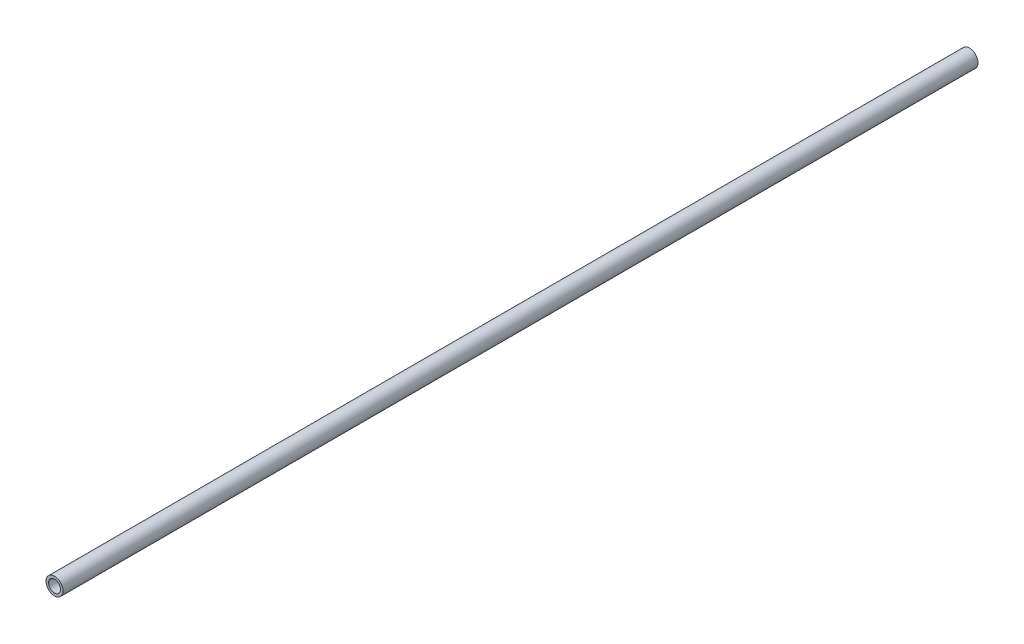
ISO-10303-21;
HEADER;
FILE_DESCRIPTION(('STEP AP214'),'2;1');
FILE_NAME('part.step','',(''),(''),'','','');
FILE_SCHEMA(('AUTOMOTIVE_DESIGN { 1 0 10303 214 1 1 1 1 }'));
ENDSEC;
DATA;
#1=APPLICATION_CONTEXT('core data for automotive mechanical design processes');
#2=APPLICATION_PROTOCOL_DEFINITION('international standard','automotive_design',2000,#1);
#3=PRODUCT_CONTEXT('',#1,'mechanical');
#4=PRODUCT('Part','Part','',(#3));
#5=PRODUCT_RELATED_PRODUCT_CATEGORY('part','',(#4));
#6=PRODUCT_DEFINITION_FORMATION('','',#4);
#7=PRODUCT_DEFINITION_CONTEXT('part definition',#1,'design');
#8=PRODUCT_DEFINITION('design','',#6,#7);
#9=PRODUCT_DEFINITION_SHAPE('','',#8);
#10=(LENGTH_UNIT() NAMED_UNIT(*) SI_UNIT(.MILLI.,.METRE.));
#11=(NAMED_UNIT(*) PLANE_ANGLE_UNIT() SI_UNIT($,.RADIAN.));
#12=(NAMED_UNIT(*) SI_UNIT($,.STERADIAN.) SOLID_ANGLE_UNIT());
#13=UNCERTAINTY_MEASURE_WITH_UNIT(LENGTH_MEASURE(1.E-05),#10,'distance_accuracy_value','');
#14=(GEOMETRIC_REPRESENTATION_CONTEXT(3) GLOBAL_UNCERTAINTY_ASSIGNED_CONTEXT((#13)) GLOBAL_UNIT_ASSIGNED_CONTEXT((#10,
#11,#12)) REPRESENTATION_CONTEXT('',''));
#15=CARTESIAN_POINT('',(0.,0.,0.));
#16=DIRECTION('',(0.,0.,1.));
#17=DIRECTION('',(1.,0.,0.));
#18=AXIS2_PLACEMENT_3D('',#15,#16,#17);
#19=CARTESIAN_POINT('',(0.,0.,1700.));
#20=DIRECTION('',(0.,0.,1.));
#21=DIRECTION('',(1.,0.,0.));
#22=AXIS2_PLACEMENT_3D('',#19,#20,#21);
#23=PLANE('',#22);
#24=CARTESIAN_POINT('',(0.,0.,1700.));
#25=DIRECTION('',(0.,0.,1.));
#26=DIRECTION('',(1.,0.,0.));
#27=AXIS2_PLACEMENT_3D('',#24,#25,#26);
#28=CIRCLE('',#27,15.875);
#29=CARTESIAN_POINT('',(15.875,0.,1700.));
#30=VERTEX_POINT('',#29);
#31=EDGE_CURVE('E10',#30,#30,#28,.T.);
#32=ORIENTED_EDGE('',*,*,#31,.T.);
#33=EDGE_LOOP('',(#32));
#34=FACE_BOUND('',#33,.T.);
#35=CARTESIAN_POINT('',(0.,0.,1700.));
#36=DIRECTION('',(0.,0.,1.));
#37=DIRECTION('',(1.,0.,0.));
#38=AXIS2_PLACEMENT_3D('',#35,#36,#37);
#39=CIRCLE('',#38,11.1);
#40=CARTESIAN_POINT('',(11.1,0.,1700.));
#41=VERTEX_POINT('',#40);
#42=EDGE_CURVE('E48',#41,#41,#39,.T.);
#43=ORIENTED_EDGE('',*,*,#42,.F.);
#44=EDGE_LOOP('',(#43));
#45=FACE_BOUND('',#44,.T.);
#46=ADVANCED_FACE('F37',(#34,#45),#23,.T.);
#47=CARTESIAN_POINT('',(0.,0.,0.));
#48=DIRECTION('',(0.,0.,1.));
#49=DIRECTION('',(1.,0.,0.));
#50=AXIS2_PLACEMENT_3D('',#47,#48,#49);
#51=PLANE('',#50);
#52=CARTESIAN_POINT('',(0.,0.,0.));
#53=DIRECTION('',(0.,0.,1.));
#54=DIRECTION('',(1.,0.,0.));
#55=AXIS2_PLACEMENT_3D('',#52,#53,#54);
#56=CIRCLE('',#55,15.875);
#57=CARTESIAN_POINT('',(15.875,0.,0.));
#58=VERTEX_POINT('',#57);
#59=EDGE_CURVE('E41',#58,#58,#56,.T.);
#60=ORIENTED_EDGE('',*,*,#59,.F.);
#61=EDGE_LOOP('',(#60));
#62=FACE_BOUND('',#61,.T.);
#63=CARTESIAN_POINT('',(0.,0.,0.));
#64=DIRECTION('',(0.,0.,1.));
#65=DIRECTION('',(1.,0.,0.));
#66=AXIS2_PLACEMENT_3D('',#63,#64,#65);
#67=CIRCLE('',#66,11.1);
#68=CARTESIAN_POINT('',(11.1,0.,0.));
#69=VERTEX_POINT('',#68);
#70=EDGE_CURVE('E50',#69,#69,#67,.T.);
#71=ORIENTED_EDGE('',*,*,#70,.T.);
#72=EDGE_LOOP('',(#71));
#73=FACE_BOUND('',#72,.T.);
#74=ADVANCED_FACE('F60',(#62,#73),#51,.F.);
#75=CARTESIAN_POINT('',(0.,0.,1700.));
#76=DIRECTION('',(0.,0.,-1.));
#77=DIRECTION('',(-1.,0.,0.));
#78=AXIS2_PLACEMENT_3D('',#75,#76,#77);
#79=CYLINDRICAL_SURFACE('',#78,15.875);
#80=ORIENTED_EDGE('',*,*,#31,.F.);
#81=EDGE_LOOP('',(#80));
#82=FACE_BOUND('',#81,.T.);
#83=ORIENTED_EDGE('',*,*,#59,.T.);
#84=EDGE_LOOP('',(#83));
#85=FACE_BOUND('',#84,.T.);
#86=ADVANCED_FACE('F39',(#82,#85),#79,.T.);
#87=CARTESIAN_POINT('',(0.,0.,1700.));
#88=DIRECTION('',(0.,0.,-1.));
#89=DIRECTION('',(-1.,0.,0.));
#90=AXIS2_PLACEMENT_3D('',#87,#88,#89);
#91=CYLINDRICAL_SURFACE('',#90,11.1);
#92=ORIENTED_EDGE('',*,*,#42,.T.);
#93=EDGE_LOOP('',(#92));
#94=FACE_BOUND('',#93,.T.);
#95=ORIENTED_EDGE('',*,*,#70,.F.);
#96=EDGE_LOOP('',(#95));
#97=FACE_BOUND('',#96,.T.);
#98=ADVANCED_FACE('F56',(#94,#97),#91,.F.);
#99=CLOSED_SHELL('',(#46,#74,#86,#98));
#100=MANIFOLD_SOLID_BREP('B2',#99);
#101=ADVANCED_BREP_SHAPE_REPRESENTATION('',(#18,#100),#14);
#102=SHAPE_DEFINITION_REPRESENTATION(#9,#101);
ENDSEC;
END-ISO-10303-21;
